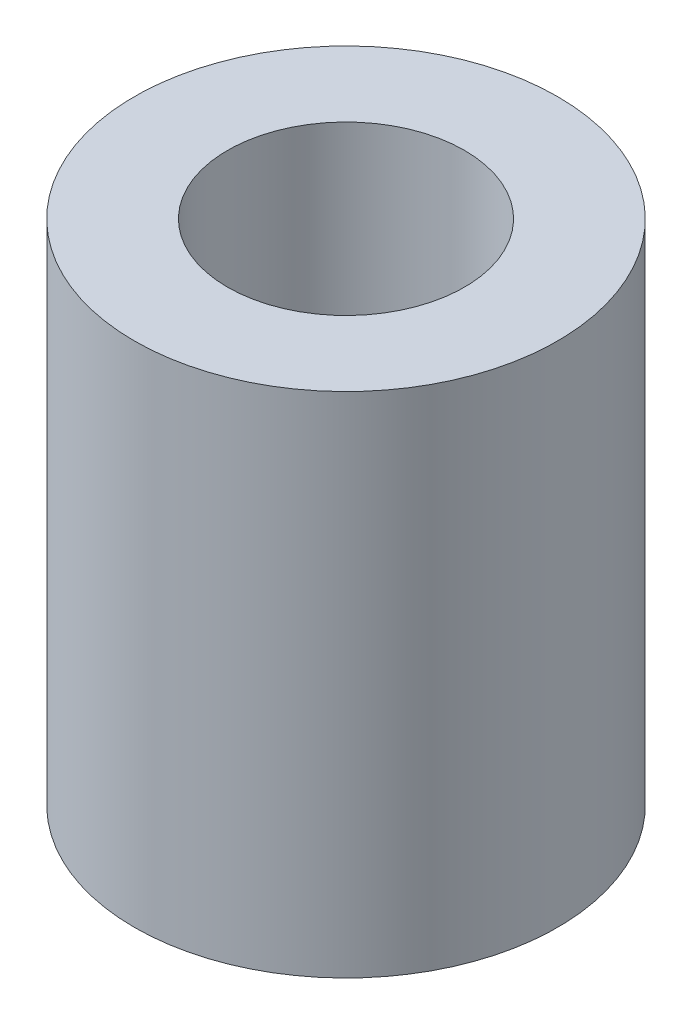
ISO-10303-21;
HEADER;
FILE_DESCRIPTION(('STEP AP214'),'2;1');
FILE_NAME('part.step','',(''),(''),'','','');
FILE_SCHEMA(('AUTOMOTIVE_DESIGN { 1 0 10303 214 1 1 1 1 }'));
ENDSEC;
DATA;
#1=APPLICATION_CONTEXT('core data for automotive mechanical design processes');
#2=APPLICATION_PROTOCOL_DEFINITION('international standard','automotive_design',2000,#1);
#3=PRODUCT_CONTEXT('',#1,'mechanical');
#4=PRODUCT('Part','Part','',(#3));
#5=PRODUCT_RELATED_PRODUCT_CATEGORY('part','',(#4));
#6=PRODUCT_DEFINITION_FORMATION('','',#4);
#7=PRODUCT_DEFINITION_CONTEXT('part definition',#1,'design');
#8=PRODUCT_DEFINITION('design','',#6,#7);
#9=PRODUCT_DEFINITION_SHAPE('','',#8);
#10=(LENGTH_UNIT() NAMED_UNIT(*) SI_UNIT(.MILLI.,.METRE.));
#11=(NAMED_UNIT(*) PLANE_ANGLE_UNIT() SI_UNIT($,.RADIAN.));
#12=(NAMED_UNIT(*) SI_UNIT($,.STERADIAN.) SOLID_ANGLE_UNIT());
#13=UNCERTAINTY_MEASURE_WITH_UNIT(LENGTH_MEASURE(1.E-05),#10,'distance_accuracy_value','');
#14=(GEOMETRIC_REPRESENTATION_CONTEXT(3) GLOBAL_UNCERTAINTY_ASSIGNED_CONTEXT((#13)) GLOBAL_UNIT_ASSIGNED_CONTEXT((#10,
#11,#12)) REPRESENTATION_CONTEXT('',''));
#15=CARTESIAN_POINT('',(0.,0.,0.));
#16=DIRECTION('',(0.,0.,1.));
#17=DIRECTION('',(1.,0.,0.));
#18=AXIS2_PLACEMENT_3D('',#15,#16,#17);
#19=CARTESIAN_POINT('',(0.,30.,0.));
#20=DIRECTION('',(0.,-1.,0.));
#21=DIRECTION('',(0.,0.,-1.));
#22=AXIS2_PLACEMENT_3D('',#19,#20,#21);
#23=CYLINDRICAL_SURFACE('',#22,12.5);
#24=CARTESIAN_POINT('',(0.,30.,0.));
#25=DIRECTION('',(0.,1.,0.));
#26=DIRECTION('',(0.,0.,1.));
#27=AXIS2_PLACEMENT_3D('',#24,#25,#26);
#28=CIRCLE('',#27,12.5);
#29=CARTESIAN_POINT('',(0.,30.,12.5));
#30=VERTEX_POINT('',#29);
#31=EDGE_CURVE('E10',#30,#30,#28,.T.);
#32=ORIENTED_EDGE('',*,*,#31,.F.);
#33=EDGE_LOOP('',(#32));
#34=FACE_BOUND('',#33,.T.);
#35=CARTESIAN_POINT('',(0.,0.,0.));
#36=DIRECTION('',(0.,1.,0.));
#37=DIRECTION('',(0.,0.,1.));
#38=AXIS2_PLACEMENT_3D('',#35,#36,#37);
#39=CIRCLE('',#38,12.5);
#40=CARTESIAN_POINT('',(0.,0.,12.5));
#41=VERTEX_POINT('',#40);
#42=EDGE_CURVE('E37',#41,#41,#39,.T.);
#43=ORIENTED_EDGE('',*,*,#42,.T.);
#44=EDGE_LOOP('',(#43));
#45=FACE_BOUND('',#44,.T.);
#46=ADVANCED_FACE('F34',(#34,#45),#23,.T.);
#47=CARTESIAN_POINT('',(0.,30.,0.));
#48=DIRECTION('',(0.,1.,0.));
#49=DIRECTION('',(0.,0.,1.));
#50=AXIS2_PLACEMENT_3D('',#47,#48,#49);
#51=PLANE('',#50);
#52=CARTESIAN_POINT('',(0.,30.,0.));
#53=DIRECTION('',(0.,1.,0.));
#54=DIRECTION('',(0.,0.,1.));
#55=AXIS2_PLACEMENT_3D('',#52,#53,#54);
#56=CIRCLE('',#55,7.);
#57=CARTESIAN_POINT('',(0.,30.,7.));
#58=VERTEX_POINT('',#57);
#59=EDGE_CURVE('E46',#58,#58,#56,.T.);
#60=ORIENTED_EDGE('',*,*,#59,.F.);
#61=EDGE_LOOP('',(#60));
#62=FACE_BOUND('',#61,.T.);
#63=ORIENTED_EDGE('',*,*,#31,.T.);
#64=EDGE_LOOP('',(#63));
#65=FACE_BOUND('',#64,.T.);
#66=ADVANCED_FACE('F71',(#62,#65),#51,.T.);
#67=CARTESIAN_POINT('',(0.,0.,0.));
#68=DIRECTION('',(0.,1.,0.));
#69=DIRECTION('',(0.,0.,1.));
#70=AXIS2_PLACEMENT_3D('',#67,#68,#69);
#71=PLANE('',#70);
#72=CARTESIAN_POINT('',(0.,0.,0.));
#73=DIRECTION('',(0.,-1.,0.));
#74=DIRECTION('',(0.,0.,-1.));
#75=AXIS2_PLACEMENT_3D('',#72,#73,#74);
#76=CIRCLE('',#75,4.);
#77=CARTESIAN_POINT('',(0.,0.,-4.));
#78=VERTEX_POINT('',#77);
#79=EDGE_CURVE('E52',#78,#78,#76,.T.);
#80=ORIENTED_EDGE('',*,*,#79,.F.);
#81=EDGE_LOOP('',(#80));
#82=FACE_BOUND('',#81,.T.);
#83=ORIENTED_EDGE('',*,*,#42,.F.);
#84=EDGE_LOOP('',(#83));
#85=FACE_BOUND('',#84,.T.);
#86=ADVANCED_FACE('F67',(#82,#85),#71,.F.);
#87=CARTESIAN_POINT('',(0.,20.,0.));
#88=DIRECTION('',(0.,1.,0.));
#89=DIRECTION('',(0.,0.,1.));
#90=AXIS2_PLACEMENT_3D('',#87,#88,#89);
#91=CYLINDRICAL_SURFACE('',#90,7.);
#92=CARTESIAN_POINT('',(0.,20.,0.));
#93=DIRECTION('',(0.,1.,0.));
#94=DIRECTION('',(0.,0.,1.));
#95=AXIS2_PLACEMENT_3D('',#92,#93,#94);
#96=CIRCLE('',#95,7.);
#97=CARTESIAN_POINT('',(0.,20.,7.));
#98=VERTEX_POINT('',#97);
#99=EDGE_CURVE('E44',#98,#98,#96,.T.);
#100=ORIENTED_EDGE('',*,*,#99,.F.);
#101=EDGE_LOOP('',(#100));
#102=FACE_BOUND('',#101,.T.);
#103=ORIENTED_EDGE('',*,*,#59,.T.);
#104=EDGE_LOOP('',(#103));
#105=FACE_BOUND('',#104,.T.);
#106=ADVANCED_FACE('F70',(#102,#105),#91,.F.);
#107=CARTESIAN_POINT('',(0.,20.,0.));
#108=DIRECTION('',(0.,1.,0.));
#109=DIRECTION('',(0.,0.,1.));
#110=AXIS2_PLACEMENT_3D('',#107,#108,#109);
#111=PLANE('',#110);
#112=ORIENTED_EDGE('',*,*,#99,.T.);
#113=EDGE_LOOP('',(#112));
#114=FACE_BOUND('',#113,.T.);
#115=ADVANCED_FACE('F63',(#114),#111,.T.);
#116=CARTESIAN_POINT('',(0.,10.,0.));
#117=DIRECTION('',(0.,-1.,0.));
#118=DIRECTION('',(0.,0.,-1.));
#119=AXIS2_PLACEMENT_3D('',#116,#117,#118);
#120=CYLINDRICAL_SURFACE('',#119,4.);
#121=CARTESIAN_POINT('',(0.,10.,0.));
#122=DIRECTION('',(0.,-1.,0.));
#123=DIRECTION('',(0.,0.,-1.));
#124=AXIS2_PLACEMENT_3D('',#121,#122,#123);
#125=CIRCLE('',#124,4.);
#126=CARTESIAN_POINT('',(0.,10.,-4.));
#127=VERTEX_POINT('',#126);
#128=EDGE_CURVE('E49',#127,#127,#125,.T.);
#129=ORIENTED_EDGE('',*,*,#128,.F.);
#130=EDGE_LOOP('',(#129));
#131=FACE_BOUND('',#130,.T.);
#132=ORIENTED_EDGE('',*,*,#79,.T.);
#133=EDGE_LOOP('',(#132));
#134=FACE_BOUND('',#133,.T.);
#135=ADVANCED_FACE('F60',(#131,#134),#120,.F.);
#136=CARTESIAN_POINT('',(0.,10.,0.));
#137=DIRECTION('',(0.,-1.,0.));
#138=DIRECTION('',(0.,0.,-1.));
#139=AXIS2_PLACEMENT_3D('',#136,#137,#138);
#140=PLANE('',#139);
#141=ORIENTED_EDGE('',*,*,#128,.T.);
#142=EDGE_LOOP('',(#141));
#143=FACE_BOUND('',#142,.T.);
#144=ADVANCED_FACE('F58',(#143),#140,.T.);
#145=CLOSED_SHELL('',(#46,#66,#86,#106,#115,#135,#144));
#146=MANIFOLD_SOLID_BREP('B2',#145);
#147=ADVANCED_BREP_SHAPE_REPRESENTATION('',(#18,#146),#14);
#148=SHAPE_DEFINITION_REPRESENTATION(#9,#147);
ENDSEC;
END-ISO-10303-21;
